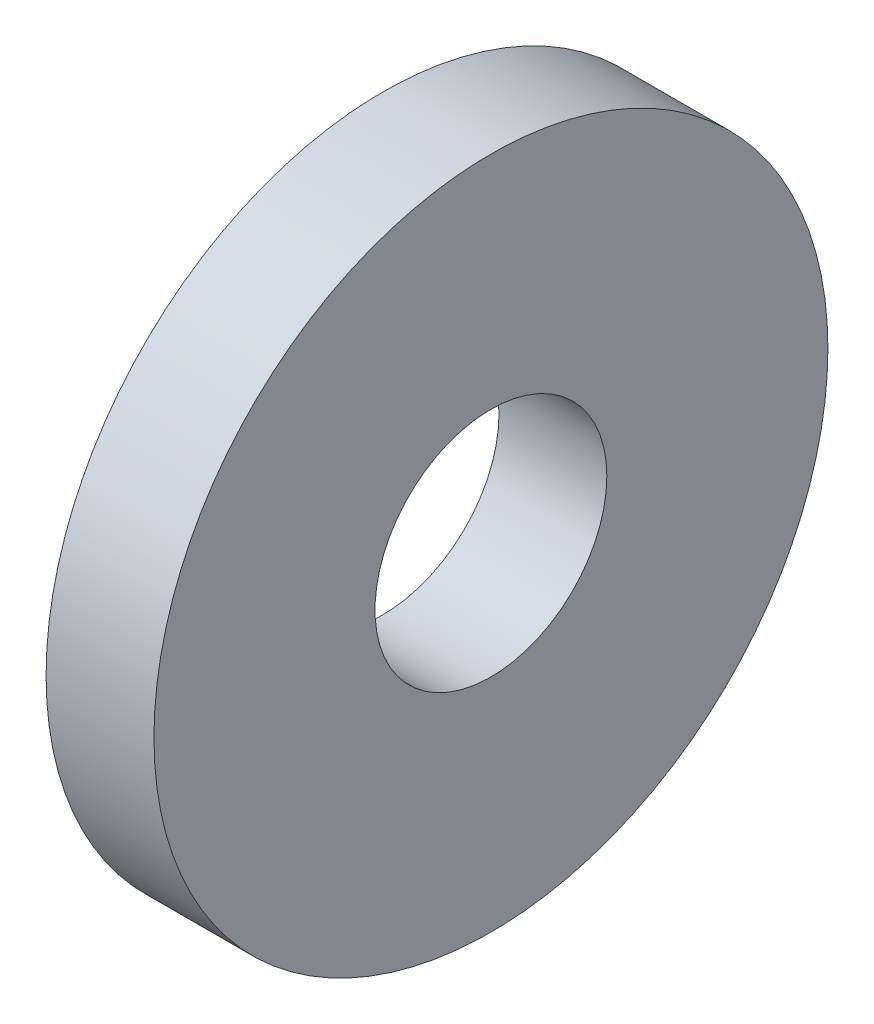
ISO-10303-21;
HEADER;
FILE_DESCRIPTION(('STEP AP214'),'2;1');
FILE_NAME('part.step','',(''),(''),'','','');
FILE_SCHEMA(('AUTOMOTIVE_DESIGN { 1 0 10303 214 1 1 1 1 }'));
ENDSEC;
DATA;
#1=APPLICATION_CONTEXT('core data for automotive mechanical design processes');
#2=APPLICATION_PROTOCOL_DEFINITION('international standard','automotive_design',2000,#1);
#3=PRODUCT_CONTEXT('',#1,'mechanical');
#4=PRODUCT('Part','Part','',(#3));
#5=PRODUCT_RELATED_PRODUCT_CATEGORY('part','',(#4));
#6=PRODUCT_DEFINITION_FORMATION('','',#4);
#7=PRODUCT_DEFINITION_CONTEXT('part definition',#1,'design');
#8=PRODUCT_DEFINITION('design','',#6,#7);
#9=PRODUCT_DEFINITION_SHAPE('','',#8);
#10=(LENGTH_UNIT() NAMED_UNIT(*) SI_UNIT(.MILLI.,.METRE.));
#11=(NAMED_UNIT(*) PLANE_ANGLE_UNIT() SI_UNIT($,.RADIAN.));
#12=(NAMED_UNIT(*) SI_UNIT($,.STERADIAN.) SOLID_ANGLE_UNIT());
#13=UNCERTAINTY_MEASURE_WITH_UNIT(LENGTH_MEASURE(1.E-05),#10,'distance_accuracy_value','');
#14=(GEOMETRIC_REPRESENTATION_CONTEXT(3) GLOBAL_UNCERTAINTY_ASSIGNED_CONTEXT((#13)) GLOBAL_UNIT_ASSIGNED_CONTEXT((#10,
#11,#12)) REPRESENTATION_CONTEXT('',''));
#15=CARTESIAN_POINT('',(0.,0.,0.));
#16=DIRECTION('',(0.,0.,1.));
#17=DIRECTION('',(1.,0.,0.));
#18=AXIS2_PLACEMENT_3D('',#15,#16,#17);
#19=CARTESIAN_POINT('',(2.032,0.,0.));
#20=DIRECTION('',(1.,0.,0.));
#21=DIRECTION('',(0.,0.,-1.));
#22=AXIS2_PLACEMENT_3D('',#19,#20,#21);
#23=PLANE('',#22);
#24=CARTESIAN_POINT('',(2.032,0.,0.));
#25=DIRECTION('',(1.,0.,0.));
#26=DIRECTION('',(0.,0.,-1.));
#27=AXIS2_PLACEMENT_3D('',#24,#25,#26);
#28=CIRCLE('',#27,6.35);
#29=CARTESIAN_POINT('',(2.032,0.,-6.35));
#30=VERTEX_POINT('',#29);
#31=EDGE_CURVE('E10',#30,#30,#28,.T.);
#32=ORIENTED_EDGE('',*,*,#31,.T.);
#33=EDGE_LOOP('',(#32));
#34=FACE_BOUND('',#33,.T.);
#35=CARTESIAN_POINT('',(2.032,0.,0.));
#36=DIRECTION('',(1.,0.,0.));
#37=DIRECTION('',(0.,0.,-1.));
#38=AXIS2_PLACEMENT_3D('',#35,#36,#37);
#39=CIRCLE('',#38,2.1844);
#40=CARTESIAN_POINT('',(2.032,0.,-2.1844));
#41=VERTEX_POINT('',#40);
#42=EDGE_CURVE('E41',#41,#41,#39,.T.);
#43=ORIENTED_EDGE('',*,*,#42,.F.);
#44=EDGE_LOOP('',(#43));
#45=FACE_BOUND('',#44,.T.);
#46=ADVANCED_FACE('F30',(#34,#45),#23,.T.);
#47=CARTESIAN_POINT('',(0.,0.,0.));
#48=DIRECTION('',(1.,0.,0.));
#49=DIRECTION('',(0.,0.,-1.));
#50=AXIS2_PLACEMENT_3D('',#47,#48,#49);
#51=PLANE('',#50);
#52=CARTESIAN_POINT('',(0.,0.,0.));
#53=DIRECTION('',(1.,0.,0.));
#54=DIRECTION('',(0.,0.,-1.));
#55=AXIS2_PLACEMENT_3D('',#52,#53,#54);
#56=CIRCLE('',#55,6.35);
#57=CARTESIAN_POINT('',(0.,0.,-6.35));
#58=VERTEX_POINT('',#57);
#59=EDGE_CURVE('E34',#58,#58,#56,.T.);
#60=ORIENTED_EDGE('',*,*,#59,.F.);
#61=EDGE_LOOP('',(#60));
#62=FACE_BOUND('',#61,.T.);
#63=CARTESIAN_POINT('',(0.,0.,0.));
#64=DIRECTION('',(1.,0.,0.));
#65=DIRECTION('',(0.,0.,-1.));
#66=AXIS2_PLACEMENT_3D('',#63,#64,#65);
#67=CIRCLE('',#66,2.1844);
#68=CARTESIAN_POINT('',(0.,0.,-2.1844));
#69=VERTEX_POINT('',#68);
#70=EDGE_CURVE('E43',#69,#69,#67,.T.);
#71=ORIENTED_EDGE('',*,*,#70,.T.);
#72=EDGE_LOOP('',(#71));
#73=FACE_BOUND('',#72,.T.);
#74=ADVANCED_FACE('F53',(#62,#73),#51,.F.);
#75=CARTESIAN_POINT('',(2.032,0.,0.));
#76=DIRECTION('',(-1.,0.,0.));
#77=DIRECTION('',(0.,0.,1.));
#78=AXIS2_PLACEMENT_3D('',#75,#76,#77);
#79=CYLINDRICAL_SURFACE('',#78,6.35);
#80=ORIENTED_EDGE('',*,*,#31,.F.);
#81=EDGE_LOOP('',(#80));
#82=FACE_BOUND('',#81,.T.);
#83=ORIENTED_EDGE('',*,*,#59,.T.);
#84=EDGE_LOOP('',(#83));
#85=FACE_BOUND('',#84,.T.);
#86=ADVANCED_FACE('F32',(#82,#85),#79,.T.);
#87=CARTESIAN_POINT('',(2.032,0.,0.));
#88=DIRECTION('',(-1.,0.,0.));
#89=DIRECTION('',(0.,0.,1.));
#90=AXIS2_PLACEMENT_3D('',#87,#88,#89);
#91=CYLINDRICAL_SURFACE('',#90,2.1844);
#92=ORIENTED_EDGE('',*,*,#42,.T.);
#93=EDGE_LOOP('',(#92));
#94=FACE_BOUND('',#93,.T.);
#95=ORIENTED_EDGE('',*,*,#70,.F.);
#96=EDGE_LOOP('',(#95));
#97=FACE_BOUND('',#96,.T.);
#98=ADVANCED_FACE('F49',(#94,#97),#91,.F.);
#99=CLOSED_SHELL('',(#46,#74,#86,#98));
#100=MANIFOLD_SOLID_BREP('B2',#99);
#101=ADVANCED_BREP_SHAPE_REPRESENTATION('',(#18,#100),#14);
#102=SHAPE_DEFINITION_REPRESENTATION(#9,#101);
ENDSEC;
END-ISO-10303-21;
